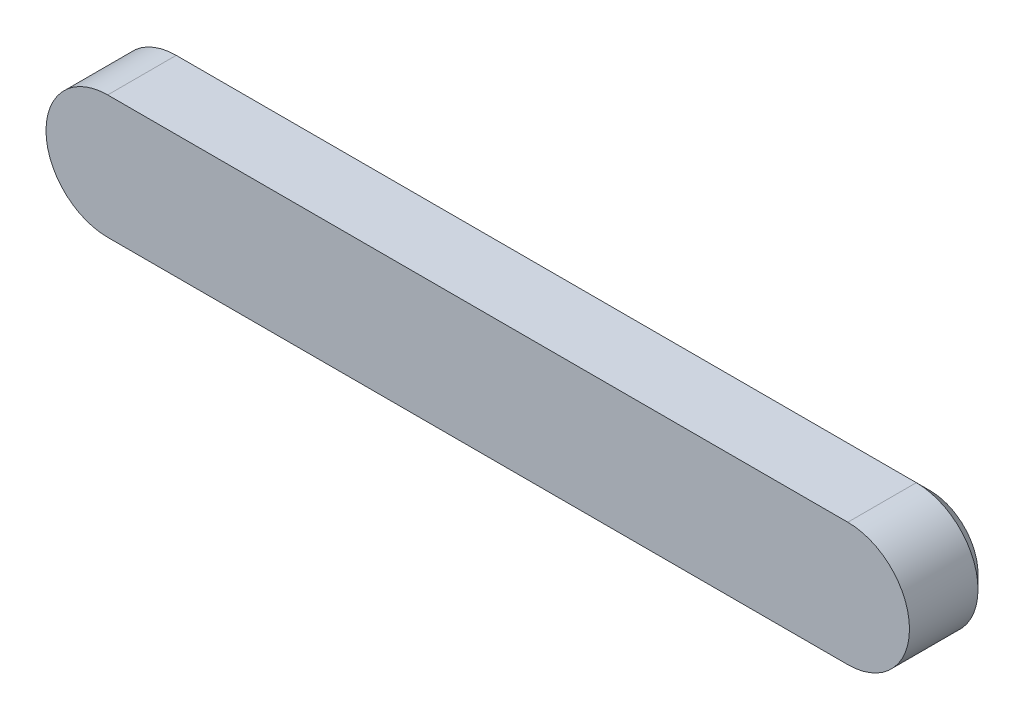
ISO-10303-21;
HEADER;
FILE_DESCRIPTION(('STEP AP214'),'2;1');
FILE_NAME('part.step','',(''),(''),'','','');
FILE_SCHEMA(('AUTOMOTIVE_DESIGN { 1 0 10303 214 1 1 1 1 }'));
ENDSEC;
DATA;
#1=APPLICATION_CONTEXT('core data for automotive mechanical design processes');
#2=APPLICATION_PROTOCOL_DEFINITION('international standard','automotive_design',2000,#1);
#3=PRODUCT_CONTEXT('',#1,'mechanical');
#4=PRODUCT('Part','Part','',(#3));
#5=PRODUCT_RELATED_PRODUCT_CATEGORY('part','',(#4));
#6=PRODUCT_DEFINITION_FORMATION('','',#4);
#7=PRODUCT_DEFINITION_CONTEXT('part definition',#1,'design');
#8=PRODUCT_DEFINITION('design','',#6,#7);
#9=PRODUCT_DEFINITION_SHAPE('','',#8);
#10=(LENGTH_UNIT() NAMED_UNIT(*) SI_UNIT(.MILLI.,.METRE.));
#11=(NAMED_UNIT(*) PLANE_ANGLE_UNIT() SI_UNIT($,.RADIAN.));
#12=(NAMED_UNIT(*) SI_UNIT($,.STERADIAN.) SOLID_ANGLE_UNIT());
#13=UNCERTAINTY_MEASURE_WITH_UNIT(LENGTH_MEASURE(1.E-05),#10,'distance_accuracy_value','');
#14=(GEOMETRIC_REPRESENTATION_CONTEXT(3) GLOBAL_UNCERTAINTY_ASSIGNED_CONTEXT((#13)) GLOBAL_UNIT_ASSIGNED_CONTEXT((#10,
#11,#12)) REPRESENTATION_CONTEXT('',''));
#15=CARTESIAN_POINT('',(0.,0.,0.));
#16=DIRECTION('',(0.,0.,1.));
#17=DIRECTION('',(1.,0.,0.));
#18=AXIS2_PLACEMENT_3D('',#15,#16,#17);
#19=CARTESIAN_POINT('',(54.,0.,-3.));
#20=DIRECTION('',(0.,0.,1.));
#21=DIRECTION('',(1.,0.,0.));
#22=AXIS2_PLACEMENT_3D('',#19,#20,#21);
#23=CYLINDRICAL_SURFACE('',#22,2.2);
#24=CARTESIAN_POINT('',(54.,0.,-3.));
#25=DIRECTION('',(0.,0.,1.));
#26=DIRECTION('',(1.,0.,0.));
#27=AXIS2_PLACEMENT_3D('',#24,#25,#26);
#28=CIRCLE('',#27,2.2);
#29=CARTESIAN_POINT('',(56.2,0.,-3.));
#30=VERTEX_POINT('',#29);
#31=EDGE_CURVE('E168',#30,#30,#28,.T.);
#32=ORIENTED_EDGE('',*,*,#31,.F.);
#33=EDGE_LOOP('',(#32));
#34=FACE_BOUND('',#33,.T.);
#35=CARTESIAN_POINT('',(54.,0.,1.));
#36=DIRECTION('',(0.,0.,1.));
#37=DIRECTION('',(1.,0.,0.));
#38=AXIS2_PLACEMENT_3D('',#35,#36,#37);
#39=CIRCLE('',#38,2.2);
#40=CARTESIAN_POINT('',(56.2,0.,1.));
#41=VERTEX_POINT('',#40);
#42=EDGE_CURVE('E189',#41,#41,#39,.F.);
#43=ORIENTED_EDGE('',*,*,#42,.F.);
#44=EDGE_LOOP('',(#43));
#45=FACE_BOUND('',#44,.T.);
#46=ADVANCED_FACE('F103',(#34,#45),#23,.F.);
#47=CARTESIAN_POINT('',(0.,0.,-3.));
#48=DIRECTION('',(0.,0.,1.));
#49=DIRECTION('',(1.,0.,0.));
#50=AXIS2_PLACEMENT_3D('',#47,#48,#49);
#51=CYLINDRICAL_SURFACE('',#50,2.2);
#52=CARTESIAN_POINT('',(0.,0.,-3.));
#53=DIRECTION('',(0.,0.,1.));
#54=DIRECTION('',(1.,0.,0.));
#55=AXIS2_PLACEMENT_3D('',#52,#53,#54);
#56=CIRCLE('',#55,2.2);
#57=CARTESIAN_POINT('',(2.2,0.,-3.));
#58=VERTEX_POINT('',#57);
#59=EDGE_CURVE('E195',#58,#58,#56,.T.);
#60=ORIENTED_EDGE('',*,*,#59,.F.);
#61=EDGE_LOOP('',(#60));
#62=FACE_BOUND('',#61,.T.);
#63=CARTESIAN_POINT('',(0.,0.,1.));
#64=DIRECTION('',(0.,0.,1.));
#65=DIRECTION('',(1.,0.,0.));
#66=AXIS2_PLACEMENT_3D('',#63,#64,#65);
#67=CIRCLE('',#66,2.2);
#68=CARTESIAN_POINT('',(2.2,0.,1.));
#69=VERTEX_POINT('',#68);
#70=EDGE_CURVE('E205',#69,#69,#67,.F.);
#71=ORIENTED_EDGE('',*,*,#70,.F.);
#72=EDGE_LOOP('',(#71));
#73=FACE_BOUND('',#72,.T.);
#74=ADVANCED_FACE('F267',(#62,#73),#51,.F.);
#75=CARTESIAN_POINT('',(0.,-4.5,-3.));
#76=DIRECTION('',(0.,-1.,0.));
#77=DIRECTION('',(0.,0.,-1.));
#78=AXIS2_PLACEMENT_3D('',#75,#76,#77);
#79=PLANE('',#78);
#80=DIRECTION('',(0.,0.,1.));
#81=VECTOR('',#80,1.);
#82=CARTESIAN_POINT('',(0.,-4.5,-3.));
#83=LINE('',#82,#81);
#84=CARTESIAN_POINT('',(0.,-4.5,-2.));
#85=VERTEX_POINT('',#84);
#86=CARTESIAN_POINT('',(0.,-4.5,3.));
#87=VERTEX_POINT('',#86);
#88=EDGE_CURVE('E202',#85,#87,#83,.T.);
#89=ORIENTED_EDGE('',*,*,#88,.F.);
#90=DIRECTION('',(1.,0.,0.));
#91=VECTOR('',#90,1.);
#92=CARTESIAN_POINT('',(54.,-4.5,-2.));
#93=LINE('',#92,#91);
#94=CARTESIAN_POINT('',(54.,-4.5,-2.));
#95=VERTEX_POINT('',#94);
#96=EDGE_CURVE('E165',#85,#95,#93,.T.);
#97=ORIENTED_EDGE('',*,*,#96,.T.);
#98=DIRECTION('',(0.,0.,1.));
#99=VECTOR('',#98,1.);
#100=CARTESIAN_POINT('',(54.,-4.5,-3.));
#101=LINE('',#100,#99);
#102=CARTESIAN_POINT('',(54.,-4.5,3.));
#103=VERTEX_POINT('',#102);
#104=EDGE_CURVE('E158',#95,#103,#101,.T.);
#105=ORIENTED_EDGE('',*,*,#104,.T.);
#106=DIRECTION('',(1.,0.,0.));
#107=VECTOR('',#106,1.);
#108=CARTESIAN_POINT('',(0.,-4.5,3.));
#109=LINE('',#108,#107);
#110=EDGE_CURVE('E163',#87,#103,#109,.T.);
#111=ORIENTED_EDGE('',*,*,#110,.F.);
#112=EDGE_LOOP('',(#89,#97,#105,#111));
#113=FACE_BOUND('',#112,.T.);
#114=ADVANCED_FACE('F161',(#113),#79,.T.);
#115=CARTESIAN_POINT('',(0.,0.,-3.));
#116=DIRECTION('',(0.,0.,1.));
#117=DIRECTION('',(1.,0.,0.));
#118=AXIS2_PLACEMENT_3D('',#115,#116,#117);
#119=CYLINDRICAL_SURFACE('',#118,4.5);
#120=DIRECTION('',(0.,0.,1.));
#121=VECTOR('',#120,1.);
#122=CARTESIAN_POINT('',(0.,4.5,-3.));
#123=LINE('',#122,#121);
#124=CARTESIAN_POINT('',(0.,4.5,-2.));
#125=VERTEX_POINT('',#124);
#126=CARTESIAN_POINT('',(0.,4.5,3.));
#127=VERTEX_POINT('',#126);
#128=EDGE_CURVE('E206',#125,#127,#123,.T.);
#129=ORIENTED_EDGE('',*,*,#128,.F.);
#130=CARTESIAN_POINT('',(0.,0.,-2.));
#131=DIRECTION('',(0.,0.,1.));
#132=DIRECTION('',(1.,0.,0.));
#133=AXIS2_PLACEMENT_3D('',#130,#131,#132);
#134=CIRCLE('',#133,4.5);
#135=EDGE_CURVE('E229',#125,#85,#134,.T.);
#136=ORIENTED_EDGE('',*,*,#135,.T.);
#137=ORIENTED_EDGE('',*,*,#88,.T.);
#138=CARTESIAN_POINT('',(0.,0.,3.));
#139=DIRECTION('',(0.,0.,1.));
#140=DIRECTION('',(1.,0.,0.));
#141=AXIS2_PLACEMENT_3D('',#138,#139,#140);
#142=CIRCLE('',#141,4.5);
#143=EDGE_CURVE('E182',#127,#87,#142,.T.);
#144=ORIENTED_EDGE('',*,*,#143,.F.);
#145=EDGE_LOOP('',(#129,#136,#137,#144));
#146=FACE_BOUND('',#145,.T.);
#147=ADVANCED_FACE('F255',(#146),#119,.T.);
#148=CARTESIAN_POINT('',(0.,4.5,-3.));
#149=DIRECTION('',(0.,-1.,0.));
#150=DIRECTION('',(0.,0.,-1.));
#151=AXIS2_PLACEMENT_3D('',#148,#149,#150);
#152=PLANE('',#151);
#153=DIRECTION('',(0.,0.,1.));
#154=VECTOR('',#153,1.);
#155=CARTESIAN_POINT('',(54.,4.5,-3.));
#156=LINE('',#155,#154);
#157=CARTESIAN_POINT('',(54.,4.5,-2.));
#158=VERTEX_POINT('',#157);
#159=CARTESIAN_POINT('',(54.,4.5,3.));
#160=VERTEX_POINT('',#159);
#161=EDGE_CURVE('E167',#158,#160,#156,.T.);
#162=ORIENTED_EDGE('',*,*,#161,.F.);
#163=DIRECTION('',(-1.,0.,0.));
#164=VECTOR('',#163,1.);
#165=CARTESIAN_POINT('',(0.,4.5,-2.));
#166=LINE('',#165,#164);
#167=EDGE_CURVE('E12',#158,#125,#166,.T.);
#168=ORIENTED_EDGE('',*,*,#167,.T.);
#169=ORIENTED_EDGE('',*,*,#128,.T.);
#170=DIRECTION('',(1.,0.,0.));
#171=VECTOR('',#170,1.);
#172=CARTESIAN_POINT('',(0.,4.5,3.));
#173=LINE('',#172,#171);
#174=EDGE_CURVE('E177',#127,#160,#173,.T.);
#175=ORIENTED_EDGE('',*,*,#174,.T.);
#176=EDGE_LOOP('',(#162,#168,#169,#175));
#177=FACE_BOUND('',#176,.T.);
#178=ADVANCED_FACE('F256',(#177),#152,.F.);
#179=CARTESIAN_POINT('',(54.,0.,-3.));
#180=DIRECTION('',(0.,0.,1.));
#181=DIRECTION('',(1.,0.,0.));
#182=AXIS2_PLACEMENT_3D('',#179,#180,#181);
#183=CYLINDRICAL_SURFACE('',#182,4.5);
#184=ORIENTED_EDGE('',*,*,#104,.F.);
#185=CARTESIAN_POINT('',(54.,0.,-2.));
#186=DIRECTION('',(0.,0.,1.));
#187=DIRECTION('',(1.,0.,0.));
#188=AXIS2_PLACEMENT_3D('',#185,#186,#187);
#189=CIRCLE('',#188,4.5);
#190=EDGE_CURVE('E114',#95,#158,#189,.T.);
#191=ORIENTED_EDGE('',*,*,#190,.T.);
#192=ORIENTED_EDGE('',*,*,#161,.T.);
#193=CARTESIAN_POINT('',(54.,0.,3.));
#194=DIRECTION('',(0.,0.,1.));
#195=DIRECTION('',(1.,0.,0.));
#196=AXIS2_PLACEMENT_3D('',#193,#194,#195);
#197=CIRCLE('',#196,4.5);
#198=EDGE_CURVE('E171',#103,#160,#197,.T.);
#199=ORIENTED_EDGE('',*,*,#198,.F.);
#200=EDGE_LOOP('',(#184,#191,#192,#199));
#201=FACE_BOUND('',#200,.T.);
#202=ADVANCED_FACE('F172',(#201),#183,.T.);
#203=CARTESIAN_POINT('',(0.,0.,-3.));
#204=DIRECTION('',(0.,0.,1.));
#205=DIRECTION('',(1.,0.,0.));
#206=AXIS2_PLACEMENT_3D('',#203,#204,#205);
#207=PLANE('',#206);
#208=CARTESIAN_POINT('',(54.,0.,-3.));
#209=DIRECTION('',(0.,0.,1.));
#210=DIRECTION('',(1.,0.,0.));
#211=AXIS2_PLACEMENT_3D('',#208,#209,#210);
#212=CIRCLE('',#211,3.5);
#213=CARTESIAN_POINT('',(54.,3.5,-3.));
#214=VERTEX_POINT('',#213);
#215=CARTESIAN_POINT('',(54.,-3.5,-3.));
#216=VERTEX_POINT('',#215);
#217=EDGE_CURVE('E219',#214,#216,#212,.F.);
#218=ORIENTED_EDGE('',*,*,#217,.T.);
#219=DIRECTION('',(-1.,0.,0.));
#220=VECTOR('',#219,1.);
#221=CARTESIAN_POINT('',(0.,-3.5,-3.));
#222=LINE('',#221,#220);
#223=CARTESIAN_POINT('',(0.,-3.5,-3.));
#224=VERTEX_POINT('',#223);
#225=EDGE_CURVE('E225',#216,#224,#222,.T.);
#226=ORIENTED_EDGE('',*,*,#225,.T.);
#227=CARTESIAN_POINT('',(0.,0.,-3.));
#228=DIRECTION('',(0.,0.,1.));
#229=DIRECTION('',(1.,0.,0.));
#230=AXIS2_PLACEMENT_3D('',#227,#228,#229);
#231=CIRCLE('',#230,3.5);
#232=CARTESIAN_POINT('',(0.,3.5,-3.));
#233=VERTEX_POINT('',#232);
#234=EDGE_CURVE('E222',#224,#233,#231,.F.);
#235=ORIENTED_EDGE('',*,*,#234,.T.);
#236=DIRECTION('',(1.,0.,0.));
#237=VECTOR('',#236,1.);
#238=CARTESIAN_POINT('',(0.,3.5,-3.));
#239=LINE('',#238,#237);
#240=EDGE_CURVE('E216',#233,#214,#239,.T.);
#241=ORIENTED_EDGE('',*,*,#240,.T.);
#242=EDGE_LOOP('',(#218,#226,#235,#241));
#243=FACE_BOUND('',#242,.T.);
#244=ORIENTED_EDGE('',*,*,#59,.T.);
#245=EDGE_LOOP('',(#244));
#246=FACE_BOUND('',#245,.T.);
#247=ORIENTED_EDGE('',*,*,#31,.T.);
#248=EDGE_LOOP('',(#247));
#249=FACE_BOUND('',#248,.T.);
#250=ADVANCED_FACE('F263',(#243,#246,#249),#207,.F.);
#251=CARTESIAN_POINT('',(0.,0.,3.));
#252=DIRECTION('',(0.,0.,1.));
#253=DIRECTION('',(1.,0.,0.));
#254=AXIS2_PLACEMENT_3D('',#251,#252,#253);
#255=PLANE('',#254);
#256=ORIENTED_EDGE('',*,*,#110,.T.);
#257=ORIENTED_EDGE('',*,*,#198,.T.);
#258=ORIENTED_EDGE('',*,*,#174,.F.);
#259=ORIENTED_EDGE('',*,*,#143,.T.);
#260=EDGE_LOOP('',(#256,#257,#258,#259));
#261=FACE_BOUND('',#260,.T.);
#262=ADVANCED_FACE('F180',(#261),#255,.T.);
#263=CARTESIAN_POINT('',(0.,0.,1.));
#264=DIRECTION('',(0.,0.,1.));
#265=DIRECTION('',(1.,0.,0.));
#266=AXIS2_PLACEMENT_3D('',#263,#264,#265);
#267=PLANE('',#266);
#268=ORIENTED_EDGE('',*,*,#70,.T.);
#269=EDGE_LOOP('',(#268));
#270=FACE_BOUND('',#269,.T.);
#271=ADVANCED_FACE('F283',(#270),#267,.F.);
#272=ORIENTED_EDGE('',*,*,#42,.T.);
#273=EDGE_LOOP('',(#272));
#274=FACE_BOUND('',#273,.T.);
#275=ADVANCED_FACE('F284',(#274),#267,.F.);
#276=CARTESIAN_POINT('',(0.,3.5,-3.));
#277=DIRECTION('',(0.,-0.707106781186547,0.707106781186547));
#278=DIRECTION('',(1.,0.,0.));
#279=AXIS2_PLACEMENT_3D('',#276,#277,#278);
#280=PLANE('',#279);
#281=DIRECTION('',(0.,0.707106781186547,0.707106781186547));
#282=VECTOR('',#281,1.);
#283=CARTESIAN_POINT('',(54.,3.5,-3.));
#284=LINE('',#283,#282);
#285=EDGE_CURVE('E187',#214,#158,#284,.T.);
#286=ORIENTED_EDGE('',*,*,#285,.F.);
#287=ORIENTED_EDGE('',*,*,#240,.F.);
#288=DIRECTION('',(0.,-0.707106781186547,-0.707106781186547));
#289=VECTOR('',#288,1.);
#290=CARTESIAN_POINT('',(0.,4.5,-2.));
#291=LINE('',#290,#289);
#292=EDGE_CURVE('E108',#125,#233,#291,.T.);
#293=ORIENTED_EDGE('',*,*,#292,.F.);
#294=ORIENTED_EDGE('',*,*,#167,.F.);
#295=EDGE_LOOP('',(#286,#287,#293,#294));
#296=FACE_BOUND('',#295,.T.);
#297=ADVANCED_FACE('F106',(#296),#280,.F.);
#298=CARTESIAN_POINT('',(0.,0.,-2.));
#299=DIRECTION('',(0.,0.,1.));
#300=DIRECTION('',(1.,0.,0.));
#301=AXIS2_PLACEMENT_3D('',#298,#299,#300);
#302=CONICAL_SURFACE('',#301,4.5,0.785398163397448);
#303=ORIENTED_EDGE('',*,*,#292,.T.);
#304=ORIENTED_EDGE('',*,*,#234,.F.);
#305=DIRECTION('',(0.,0.707106781186547,-0.707106781186547));
#306=VECTOR('',#305,1.);
#307=CARTESIAN_POINT('',(0.,-4.5,-2.));
#308=LINE('',#307,#306);
#309=EDGE_CURVE('E237',#85,#224,#308,.T.);
#310=ORIENTED_EDGE('',*,*,#309,.F.);
#311=ORIENTED_EDGE('',*,*,#135,.F.);
#312=EDGE_LOOP('',(#303,#304,#310,#311));
#313=FACE_BOUND('',#312,.T.);
#314=ADVANCED_FACE('F253',(#313),#302,.T.);
#315=CARTESIAN_POINT('',(54.,0.,-2.));
#316=DIRECTION('',(0.,0.,1.));
#317=DIRECTION('',(1.,0.,0.));
#318=AXIS2_PLACEMENT_3D('',#315,#316,#317);
#319=CONICAL_SURFACE('',#318,4.5,0.785398163397448);
#320=ORIENTED_EDGE('',*,*,#285,.T.);
#321=ORIENTED_EDGE('',*,*,#190,.F.);
#322=DIRECTION('',(0.,-0.707106781186547,0.707106781186547));
#323=VECTOR('',#322,1.);
#324=CARTESIAN_POINT('',(54.,-3.5,-3.));
#325=LINE('',#324,#323);
#326=EDGE_CURVE('E234',#216,#95,#325,.T.);
#327=ORIENTED_EDGE('',*,*,#326,.F.);
#328=ORIENTED_EDGE('',*,*,#217,.F.);
#329=EDGE_LOOP('',(#320,#321,#327,#328));
#330=FACE_BOUND('',#329,.T.);
#331=ADVANCED_FACE('F244',(#330),#319,.T.);
#332=CARTESIAN_POINT('',(0.,-4.5,-2.));
#333=DIRECTION('',(0.,-0.707106781186547,-0.707106781186547));
#334=DIRECTION('',(-1.,0.,0.));
#335=AXIS2_PLACEMENT_3D('',#332,#333,#334);
#336=PLANE('',#335);
#337=ORIENTED_EDGE('',*,*,#309,.T.);
#338=ORIENTED_EDGE('',*,*,#225,.F.);
#339=ORIENTED_EDGE('',*,*,#326,.T.);
#340=ORIENTED_EDGE('',*,*,#96,.F.);
#341=EDGE_LOOP('',(#337,#338,#339,#340));
#342=FACE_BOUND('',#341,.T.);
#343=ADVANCED_FACE('F360',(#342),#336,.T.);
#344=CLOSED_SHELL('',(#46,#74,#114,#147,#178,#202,#250,#262,#271,#275,#297,#314,#331,#343));
#345=MANIFOLD_SOLID_BREP('B2',#344);
#346=ADVANCED_BREP_SHAPE_REPRESENTATION('',(#18,#345),#14);
#347=SHAPE_DEFINITION_REPRESENTATION(#9,#346);
ENDSEC;
END-ISO-10303-21;
